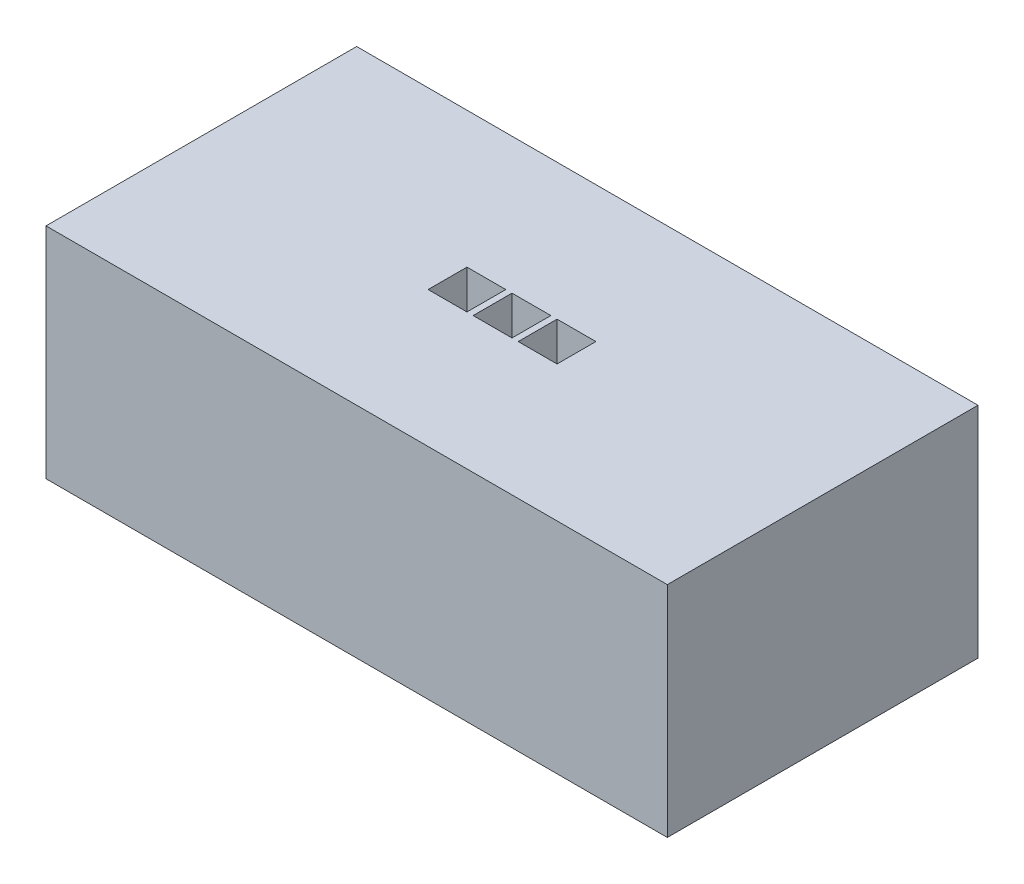
ISO-10303-21;
HEADER;
FILE_DESCRIPTION(('STEP AP214'),'2;1');
FILE_NAME('part.step','',(''),(''),'','','');
FILE_SCHEMA(('AUTOMOTIVE_DESIGN { 1 0 10303 214 1 1 1 1 }'));
ENDSEC;
DATA;
#1=APPLICATION_CONTEXT('core data for automotive mechanical design processes');
#2=APPLICATION_PROTOCOL_DEFINITION('international standard','automotive_design',2000,#1);
#3=PRODUCT_CONTEXT('',#1,'mechanical');
#4=PRODUCT('Part','Part','',(#3));
#5=PRODUCT_RELATED_PRODUCT_CATEGORY('part','',(#4));
#6=PRODUCT_DEFINITION_FORMATION('','',#4);
#7=PRODUCT_DEFINITION_CONTEXT('part definition',#1,'design');
#8=PRODUCT_DEFINITION('design','',#6,#7);
#9=PRODUCT_DEFINITION_SHAPE('','',#8);
#10=(LENGTH_UNIT() NAMED_UNIT(*) SI_UNIT(.MILLI.,.METRE.));
#11=(NAMED_UNIT(*) PLANE_ANGLE_UNIT() SI_UNIT($,.RADIAN.));
#12=(NAMED_UNIT(*) SI_UNIT($,.STERADIAN.) SOLID_ANGLE_UNIT());
#13=UNCERTAINTY_MEASURE_WITH_UNIT(LENGTH_MEASURE(1.E-05),#10,'distance_accuracy_value','');
#14=(GEOMETRIC_REPRESENTATION_CONTEXT(3) GLOBAL_UNCERTAINTY_ASSIGNED_CONTEXT((#13)) GLOBAL_UNIT_ASSIGNED_CONTEXT((#10,
#11,#12)) REPRESENTATION_CONTEXT('',''));
#15=CARTESIAN_POINT('',(0.,0.,0.));
#16=DIRECTION('',(0.,0.,1.));
#17=DIRECTION('',(1.,0.,0.));
#18=AXIS2_PLACEMENT_3D('',#15,#16,#17);
#19=CARTESIAN_POINT('',(20.,14.1,-10.));
#20=DIRECTION('',(0.,0.,1.));
#21=DIRECTION('',(1.,0.,0.));
#22=AXIS2_PLACEMENT_3D('',#19,#20,#21);
#23=PLANE('',#22);
#24=DIRECTION('',(-1.,0.,0.));
#25=VECTOR('',#24,1.);
#26=CARTESIAN_POINT('',(20.,0.,-10.));
#27=LINE('',#26,#25);
#28=CARTESIAN_POINT('',(20.,0.,-10.));
#29=VERTEX_POINT('',#28);
#30=CARTESIAN_POINT('',(-20.,0.,-10.));
#31=VERTEX_POINT('',#30);
#32=EDGE_CURVE('E181',#29,#31,#27,.T.);
#33=ORIENTED_EDGE('',*,*,#32,.T.);
#34=DIRECTION('',(0.,-1.,0.));
#35=VECTOR('',#34,1.);
#36=CARTESIAN_POINT('',(-20.,14.1,-10.));
#37=LINE('',#36,#35);
#38=CARTESIAN_POINT('',(-20.,14.1,-10.));
#39=VERTEX_POINT('',#38);
#40=EDGE_CURVE('E11',#39,#31,#37,.T.);
#41=ORIENTED_EDGE('',*,*,#40,.F.);
#42=DIRECTION('',(-1.,0.,0.));
#43=VECTOR('',#42,1.);
#44=CARTESIAN_POINT('',(20.,14.1,-10.));
#45=LINE('',#44,#43);
#46=CARTESIAN_POINT('',(20.,14.1,-10.));
#47=VERTEX_POINT('',#46);
#48=EDGE_CURVE('E246',#47,#39,#45,.T.);
#49=ORIENTED_EDGE('',*,*,#48,.F.);
#50=DIRECTION('',(0.,-1.,0.));
#51=VECTOR('',#50,1.);
#52=CARTESIAN_POINT('',(20.,14.1,-10.));
#53=LINE('',#52,#51);
#54=EDGE_CURVE('E258',#47,#29,#53,.T.);
#55=ORIENTED_EDGE('',*,*,#54,.T.);
#56=EDGE_LOOP('',(#33,#41,#49,#55));
#57=FACE_BOUND('',#56,.T.);
#58=ADVANCED_FACE('F32',(#57),#23,.F.);
#59=CARTESIAN_POINT('',(-20.,14.1,-10.));
#60=DIRECTION('',(1.,0.,0.));
#61=DIRECTION('',(0.,0.,-1.));
#62=AXIS2_PLACEMENT_3D('',#59,#60,#61);
#63=PLANE('',#62);
#64=DIRECTION('',(0.,0.,1.));
#65=VECTOR('',#64,1.);
#66=CARTESIAN_POINT('',(-20.,0.,-10.));
#67=LINE('',#66,#65);
#68=CARTESIAN_POINT('',(-20.,0.,10.));
#69=VERTEX_POINT('',#68);
#70=EDGE_CURVE('E261',#31,#69,#67,.T.);
#71=ORIENTED_EDGE('',*,*,#70,.T.);
#72=DIRECTION('',(0.,-1.,0.));
#73=VECTOR('',#72,1.);
#74=CARTESIAN_POINT('',(-20.,14.1,10.));
#75=LINE('',#74,#73);
#76=CARTESIAN_POINT('',(-20.,14.1,10.));
#77=VERTEX_POINT('',#76);
#78=EDGE_CURVE('E39',#77,#69,#75,.T.);
#79=ORIENTED_EDGE('',*,*,#78,.F.);
#80=DIRECTION('',(0.,0.,1.));
#81=VECTOR('',#80,1.);
#82=CARTESIAN_POINT('',(-20.,14.1,-10.));
#83=LINE('',#82,#81);
#84=EDGE_CURVE('E249',#39,#77,#83,.T.);
#85=ORIENTED_EDGE('',*,*,#84,.F.);
#86=ORIENTED_EDGE('',*,*,#40,.T.);
#87=EDGE_LOOP('',(#71,#79,#85,#86));
#88=FACE_BOUND('',#87,.T.);
#89=ADVANCED_FACE('F277',(#88),#63,.F.);
#90=CARTESIAN_POINT('',(20.,14.1,10.));
#91=DIRECTION('',(0.,0.,1.));
#92=DIRECTION('',(1.,0.,0.));
#93=AXIS2_PLACEMENT_3D('',#90,#91,#92);
#94=PLANE('',#93);
#95=DIRECTION('',(-1.,0.,0.));
#96=VECTOR('',#95,1.);
#97=CARTESIAN_POINT('',(20.,0.,10.));
#98=LINE('',#97,#96);
#99=CARTESIAN_POINT('',(20.,0.,10.));
#100=VERTEX_POINT('',#99);
#101=EDGE_CURVE('E264',#100,#69,#98,.T.);
#102=ORIENTED_EDGE('',*,*,#101,.F.);
#103=DIRECTION('',(0.,-1.,0.));
#104=VECTOR('',#103,1.);
#105=CARTESIAN_POINT('',(20.,14.1,10.));
#106=LINE('',#105,#104);
#107=CARTESIAN_POINT('',(20.,14.1,10.));
#108=VERTEX_POINT('',#107);
#109=EDGE_CURVE('E270',#108,#100,#106,.T.);
#110=ORIENTED_EDGE('',*,*,#109,.F.);
#111=DIRECTION('',(-1.,0.,0.));
#112=VECTOR('',#111,1.);
#113=CARTESIAN_POINT('',(20.,14.1,10.));
#114=LINE('',#113,#112);
#115=EDGE_CURVE('E252',#108,#77,#114,.T.);
#116=ORIENTED_EDGE('',*,*,#115,.T.);
#117=ORIENTED_EDGE('',*,*,#78,.T.);
#118=EDGE_LOOP('',(#102,#110,#116,#117));
#119=FACE_BOUND('',#118,.T.);
#120=ADVANCED_FACE('F274',(#119),#94,.T.);
#121=CARTESIAN_POINT('',(20.,14.1,-10.));
#122=DIRECTION('',(1.,0.,0.));
#123=DIRECTION('',(0.,0.,-1.));
#124=AXIS2_PLACEMENT_3D('',#121,#122,#123);
#125=PLANE('',#124);
#126=DIRECTION('',(0.,0.,1.));
#127=VECTOR('',#126,1.);
#128=CARTESIAN_POINT('',(20.,0.,-10.));
#129=LINE('',#128,#127);
#130=EDGE_CURVE('E250',#29,#100,#129,.T.);
#131=ORIENTED_EDGE('',*,*,#130,.F.);
#132=ORIENTED_EDGE('',*,*,#54,.F.);
#133=DIRECTION('',(0.,0.,1.));
#134=VECTOR('',#133,1.);
#135=CARTESIAN_POINT('',(20.,14.1,-10.));
#136=LINE('',#135,#134);
#137=EDGE_CURVE('E255',#47,#108,#136,.T.);
#138=ORIENTED_EDGE('',*,*,#137,.T.);
#139=ORIENTED_EDGE('',*,*,#109,.T.);
#140=EDGE_LOOP('',(#131,#132,#138,#139));
#141=FACE_BOUND('',#140,.T.);
#142=ADVANCED_FACE('F283',(#141),#125,.T.);
#143=CARTESIAN_POINT('',(0.,14.1,0.));
#144=DIRECTION('',(0.,1.,0.));
#145=DIRECTION('',(0.,0.,1.));
#146=AXIS2_PLACEMENT_3D('',#143,#144,#145);
#147=PLANE('',#146);
#148=DIRECTION('',(0.,0.,-1.));
#149=VECTOR('',#148,1.);
#150=CARTESIAN_POINT('',(-1.65,14.1,-1.25));
#151=LINE('',#150,#149);
#152=CARTESIAN_POINT('',(-1.65,14.1,1.25));
#153=VERTEX_POINT('',#152);
#154=CARTESIAN_POINT('',(-1.65,14.1,-1.25));
#155=VERTEX_POINT('',#154);
#156=EDGE_CURVE('E46',#153,#155,#151,.T.);
#157=ORIENTED_EDGE('',*,*,#156,.F.);
#158=DIRECTION('',(1.,0.,0.));
#159=VECTOR('',#158,1.);
#160=CARTESIAN_POINT('',(-4.15,14.1,1.25));
#161=LINE('',#160,#159);
#162=CARTESIAN_POINT('',(-4.15,14.1,1.25));
#163=VERTEX_POINT('',#162);
#164=EDGE_CURVE('E165',#163,#153,#161,.T.);
#165=ORIENTED_EDGE('',*,*,#164,.F.);
#166=DIRECTION('',(0.,0.,1.));
#167=VECTOR('',#166,1.);
#168=CARTESIAN_POINT('',(-4.15,14.1,-1.25));
#169=LINE('',#168,#167);
#170=CARTESIAN_POINT('',(-4.15,14.1,-1.25));
#171=VERTEX_POINT('',#170);
#172=EDGE_CURVE('E168',#171,#163,#169,.T.);
#173=ORIENTED_EDGE('',*,*,#172,.F.);
#174=DIRECTION('',(-1.,0.,0.));
#175=VECTOR('',#174,1.);
#176=CARTESIAN_POINT('',(-4.15,14.1,-1.25));
#177=LINE('',#176,#175);
#178=EDGE_CURVE('E174',#155,#171,#177,.T.);
#179=ORIENTED_EDGE('',*,*,#178,.F.);
#180=EDGE_LOOP('',(#157,#165,#173,#179));
#181=FACE_BOUND('',#180,.T.);
#182=DIRECTION('',(0.,0.,-1.));
#183=VECTOR('',#182,1.);
#184=CARTESIAN_POINT('',(1.25,14.1,-1.25));
#185=LINE('',#184,#183);
#186=CARTESIAN_POINT('',(1.25,14.1,1.25));
#187=VERTEX_POINT('',#186);
#188=CARTESIAN_POINT('',(1.25,14.1,-1.25));
#189=VERTEX_POINT('',#188);
#190=EDGE_CURVE('E54',#187,#189,#185,.T.);
#191=ORIENTED_EDGE('',*,*,#190,.F.);
#192=DIRECTION('',(1.,0.,0.));
#193=VECTOR('',#192,1.);
#194=CARTESIAN_POINT('',(-1.25,14.1,1.25));
#195=LINE('',#194,#193);
#196=CARTESIAN_POINT('',(-1.25,14.1,1.25));
#197=VERTEX_POINT('',#196);
#198=EDGE_CURVE('E189',#197,#187,#195,.T.);
#199=ORIENTED_EDGE('',*,*,#198,.F.);
#200=DIRECTION('',(0.,0.,1.));
#201=VECTOR('',#200,1.);
#202=CARTESIAN_POINT('',(-1.25,14.1,-1.25));
#203=LINE('',#202,#201);
#204=CARTESIAN_POINT('',(-1.25,14.1,-1.25));
#205=VERTEX_POINT('',#204);
#206=EDGE_CURVE('E204',#205,#197,#203,.T.);
#207=ORIENTED_EDGE('',*,*,#206,.F.);
#208=DIRECTION('',(-1.,0.,0.));
#209=VECTOR('',#208,1.);
#210=CARTESIAN_POINT('',(-1.25,14.1,-1.25));
#211=LINE('',#210,#209);
#212=EDGE_CURVE('E200',#189,#205,#211,.T.);
#213=ORIENTED_EDGE('',*,*,#212,.F.);
#214=EDGE_LOOP('',(#191,#199,#207,#213));
#215=FACE_BOUND('',#214,.T.);
#216=DIRECTION('',(0.,0.,-1.));
#217=VECTOR('',#216,1.);
#218=CARTESIAN_POINT('',(4.15,14.1,-1.25));
#219=LINE('',#218,#217);
#220=CARTESIAN_POINT('',(4.15,14.1,1.25));
#221=VERTEX_POINT('',#220);
#222=CARTESIAN_POINT('',(4.15,14.1,-1.25));
#223=VERTEX_POINT('',#222);
#224=EDGE_CURVE('E229',#221,#223,#219,.T.);
#225=ORIENTED_EDGE('',*,*,#224,.F.);
#226=DIRECTION('',(1.,0.,0.));
#227=VECTOR('',#226,1.);
#228=CARTESIAN_POINT('',(1.65,14.1,1.25));
#229=LINE('',#228,#227);
#230=CARTESIAN_POINT('',(1.65,14.1,1.25));
#231=VERTEX_POINT('',#230);
#232=EDGE_CURVE('E219',#231,#221,#229,.T.);
#233=ORIENTED_EDGE('',*,*,#232,.F.);
#234=DIRECTION('',(0.,0.,1.));
#235=VECTOR('',#234,1.);
#236=CARTESIAN_POINT('',(1.65,14.1,-1.25));
#237=LINE('',#236,#235);
#238=CARTESIAN_POINT('',(1.65,14.1,-1.25));
#239=VERTEX_POINT('',#238);
#240=EDGE_CURVE('E234',#239,#231,#237,.T.);
#241=ORIENTED_EDGE('',*,*,#240,.F.);
#242=DIRECTION('',(-1.,0.,0.));
#243=VECTOR('',#242,1.);
#244=CARTESIAN_POINT('',(1.65,14.1,-1.25));
#245=LINE('',#244,#243);
#246=EDGE_CURVE('E231',#223,#239,#245,.T.);
#247=ORIENTED_EDGE('',*,*,#246,.F.);
#248=EDGE_LOOP('',(#225,#233,#241,#247));
#249=FACE_BOUND('',#248,.T.);
#250=ORIENTED_EDGE('',*,*,#48,.T.);
#251=ORIENTED_EDGE('',*,*,#84,.T.);
#252=ORIENTED_EDGE('',*,*,#115,.F.);
#253=ORIENTED_EDGE('',*,*,#137,.F.);
#254=EDGE_LOOP('',(#250,#251,#252,#253));
#255=FACE_BOUND('',#254,.T.);
#256=ADVANCED_FACE('F287',(#181,#215,#249,#255),#147,.T.);
#257=CARTESIAN_POINT('',(0.,0.,0.));
#258=DIRECTION('',(0.,1.,0.));
#259=DIRECTION('',(0.,0.,1.));
#260=AXIS2_PLACEMENT_3D('',#257,#258,#259);
#261=PLANE('',#260);
#262=DIRECTION('',(1.,0.,0.));
#263=VECTOR('',#262,1.);
#264=CARTESIAN_POINT('',(-4.15,0.,1.25));
#265=LINE('',#264,#263);
#266=CARTESIAN_POINT('',(-4.15,0.,1.25));
#267=VERTEX_POINT('',#266);
#268=CARTESIAN_POINT('',(-1.65,0.,1.25));
#269=VERTEX_POINT('',#268);
#270=EDGE_CURVE('E152',#267,#269,#265,.T.);
#271=ORIENTED_EDGE('',*,*,#270,.T.);
#272=DIRECTION('',(0.,0.,-1.));
#273=VECTOR('',#272,1.);
#274=CARTESIAN_POINT('',(-1.65,0.,-1.25));
#275=LINE('',#274,#273);
#276=CARTESIAN_POINT('',(-1.65,0.,-1.25));
#277=VERTEX_POINT('',#276);
#278=EDGE_CURVE('E146',#269,#277,#275,.T.);
#279=ORIENTED_EDGE('',*,*,#278,.T.);
#280=DIRECTION('',(-1.,0.,0.));
#281=VECTOR('',#280,1.);
#282=CARTESIAN_POINT('',(-4.15,0.,-1.25));
#283=LINE('',#282,#281);
#284=CARTESIAN_POINT('',(-4.15,0.,-1.25));
#285=VERTEX_POINT('',#284);
#286=EDGE_CURVE('E156',#277,#285,#283,.T.);
#287=ORIENTED_EDGE('',*,*,#286,.T.);
#288=DIRECTION('',(0.,0.,1.));
#289=VECTOR('',#288,1.);
#290=CARTESIAN_POINT('',(-4.15,0.,-1.25));
#291=LINE('',#290,#289);
#292=EDGE_CURVE('E160',#285,#267,#291,.T.);
#293=ORIENTED_EDGE('',*,*,#292,.T.);
#294=EDGE_LOOP('',(#271,#279,#287,#293));
#295=FACE_BOUND('',#294,.T.);
#296=DIRECTION('',(1.,0.,0.));
#297=VECTOR('',#296,1.);
#298=CARTESIAN_POINT('',(-1.25,0.,1.25));
#299=LINE('',#298,#297);
#300=CARTESIAN_POINT('',(-1.25,0.,1.25));
#301=VERTEX_POINT('',#300);
#302=CARTESIAN_POINT('',(1.25,0.,1.25));
#303=VERTEX_POINT('',#302);
#304=EDGE_CURVE('E195',#301,#303,#299,.T.);
#305=ORIENTED_EDGE('',*,*,#304,.T.);
#306=DIRECTION('',(0.,0.,-1.));
#307=VECTOR('',#306,1.);
#308=CARTESIAN_POINT('',(1.25,0.,-1.25));
#309=LINE('',#308,#307);
#310=CARTESIAN_POINT('',(1.25,0.,-1.25));
#311=VERTEX_POINT('',#310);
#312=EDGE_CURVE('E185',#303,#311,#309,.T.);
#313=ORIENTED_EDGE('',*,*,#312,.T.);
#314=DIRECTION('',(-1.,0.,0.));
#315=VECTOR('',#314,1.);
#316=CARTESIAN_POINT('',(-1.25,0.,-1.25));
#317=LINE('',#316,#315);
#318=CARTESIAN_POINT('',(-1.25,0.,-1.25));
#319=VERTEX_POINT('',#318);
#320=EDGE_CURVE('E188',#311,#319,#317,.T.);
#321=ORIENTED_EDGE('',*,*,#320,.T.);
#322=DIRECTION('',(0.,0.,1.));
#323=VECTOR('',#322,1.);
#324=CARTESIAN_POINT('',(-1.25,0.,-1.25));
#325=LINE('',#324,#323);
#326=EDGE_CURVE('E192',#319,#301,#325,.T.);
#327=ORIENTED_EDGE('',*,*,#326,.T.);
#328=EDGE_LOOP('',(#305,#313,#321,#327));
#329=FACE_BOUND('',#328,.T.);
#330=DIRECTION('',(1.,0.,0.));
#331=VECTOR('',#330,1.);
#332=CARTESIAN_POINT('',(1.65,0.,1.25));
#333=LINE('',#332,#331);
#334=CARTESIAN_POINT('',(1.65,0.,1.25));
#335=VERTEX_POINT('',#334);
#336=CARTESIAN_POINT('',(4.15,0.,1.25));
#337=VERTEX_POINT('',#336);
#338=EDGE_CURVE('E225',#335,#337,#333,.T.);
#339=ORIENTED_EDGE('',*,*,#338,.T.);
#340=DIRECTION('',(0.,0.,-1.));
#341=VECTOR('',#340,1.);
#342=CARTESIAN_POINT('',(4.15,0.,-1.25));
#343=LINE('',#342,#341);
#344=CARTESIAN_POINT('',(4.15,0.,-1.25));
#345=VERTEX_POINT('',#344);
#346=EDGE_CURVE('E215',#337,#345,#343,.T.);
#347=ORIENTED_EDGE('',*,*,#346,.T.);
#348=DIRECTION('',(-1.,0.,0.));
#349=VECTOR('',#348,1.);
#350=CARTESIAN_POINT('',(1.65,0.,-1.25));
#351=LINE('',#350,#349);
#352=CARTESIAN_POINT('',(1.65,0.,-1.25));
#353=VERTEX_POINT('',#352);
#354=EDGE_CURVE('E218',#345,#353,#351,.T.);
#355=ORIENTED_EDGE('',*,*,#354,.T.);
#356=DIRECTION('',(0.,0.,1.));
#357=VECTOR('',#356,1.);
#358=CARTESIAN_POINT('',(1.65,0.,-1.25));
#359=LINE('',#358,#357);
#360=EDGE_CURVE('E222',#353,#335,#359,.T.);
#361=ORIENTED_EDGE('',*,*,#360,.T.);
#362=EDGE_LOOP('',(#339,#347,#355,#361));
#363=FACE_BOUND('',#362,.T.);
#364=ORIENTED_EDGE('',*,*,#32,.F.);
#365=ORIENTED_EDGE('',*,*,#130,.T.);
#366=ORIENTED_EDGE('',*,*,#101,.T.);
#367=ORIENTED_EDGE('',*,*,#70,.F.);
#368=EDGE_LOOP('',(#364,#365,#366,#367));
#369=FACE_BOUND('',#368,.T.);
#370=ADVANCED_FACE('F162',(#295,#329,#363,#369),#261,.F.);
#371=CARTESIAN_POINT('',(4.15,0.,-1.25));
#372=DIRECTION('',(1.,0.,0.));
#373=DIRECTION('',(0.,0.,-1.));
#374=AXIS2_PLACEMENT_3D('',#371,#372,#373);
#375=PLANE('',#374);
#376=ORIENTED_EDGE('',*,*,#224,.T.);
#377=DIRECTION('',(0.,1.,0.));
#378=VECTOR('',#377,1.);
#379=CARTESIAN_POINT('',(4.15,0.,-1.25));
#380=LINE('',#379,#378);
#381=EDGE_CURVE('E228',#345,#223,#380,.T.);
#382=ORIENTED_EDGE('',*,*,#381,.F.);
#383=ORIENTED_EDGE('',*,*,#346,.F.);
#384=DIRECTION('',(0.,1.,0.));
#385=VECTOR('',#384,1.);
#386=CARTESIAN_POINT('',(4.15,0.,1.25));
#387=LINE('',#386,#385);
#388=EDGE_CURVE('E201',#337,#221,#387,.T.);
#389=ORIENTED_EDGE('',*,*,#388,.T.);
#390=EDGE_LOOP('',(#376,#382,#383,#389));
#391=FACE_BOUND('',#390,.T.);
#392=ADVANCED_FACE('F302',(#391),#375,.F.);
#393=CARTESIAN_POINT('',(1.65,0.,1.25));
#394=DIRECTION('',(0.,0.,1.));
#395=DIRECTION('',(1.,0.,0.));
#396=AXIS2_PLACEMENT_3D('',#393,#394,#395);
#397=PLANE('',#396);
#398=ORIENTED_EDGE('',*,*,#232,.T.);
#399=ORIENTED_EDGE('',*,*,#388,.F.);
#400=ORIENTED_EDGE('',*,*,#338,.F.);
#401=DIRECTION('',(0.,1.,0.));
#402=VECTOR('',#401,1.);
#403=CARTESIAN_POINT('',(1.65,0.,1.25));
#404=LINE('',#403,#402);
#405=EDGE_CURVE('E240',#335,#231,#404,.T.);
#406=ORIENTED_EDGE('',*,*,#405,.T.);
#407=EDGE_LOOP('',(#398,#399,#400,#406));
#408=FACE_BOUND('',#407,.T.);
#409=ADVANCED_FACE('F308',(#408),#397,.F.);
#410=CARTESIAN_POINT('',(1.65,0.,-1.25));
#411=DIRECTION('',(-1.,0.,0.));
#412=DIRECTION('',(0.,0.,1.));
#413=AXIS2_PLACEMENT_3D('',#410,#411,#412);
#414=PLANE('',#413);
#415=ORIENTED_EDGE('',*,*,#240,.T.);
#416=ORIENTED_EDGE('',*,*,#405,.F.);
#417=ORIENTED_EDGE('',*,*,#360,.F.);
#418=DIRECTION('',(0.,1.,0.));
#419=VECTOR('',#418,1.);
#420=CARTESIAN_POINT('',(1.65,0.,-1.25));
#421=LINE('',#420,#419);
#422=EDGE_CURVE('E242',#353,#239,#421,.T.);
#423=ORIENTED_EDGE('',*,*,#422,.T.);
#424=EDGE_LOOP('',(#415,#416,#417,#423));
#425=FACE_BOUND('',#424,.T.);
#426=ADVANCED_FACE('F314',(#425),#414,.F.);
#427=CARTESIAN_POINT('',(1.65,0.,-1.25));
#428=DIRECTION('',(0.,0.,-1.));
#429=DIRECTION('',(-1.,0.,0.));
#430=AXIS2_PLACEMENT_3D('',#427,#428,#429);
#431=PLANE('',#430);
#432=ORIENTED_EDGE('',*,*,#246,.T.);
#433=ORIENTED_EDGE('',*,*,#422,.F.);
#434=ORIENTED_EDGE('',*,*,#354,.F.);
#435=ORIENTED_EDGE('',*,*,#381,.T.);
#436=EDGE_LOOP('',(#432,#433,#434,#435));
#437=FACE_BOUND('',#436,.T.);
#438=ADVANCED_FACE('F310',(#437),#431,.F.);
#439=CARTESIAN_POINT('',(1.25,0.,-1.25));
#440=DIRECTION('',(1.,0.,0.));
#441=DIRECTION('',(0.,0.,-1.));
#442=AXIS2_PLACEMENT_3D('',#439,#440,#441);
#443=PLANE('',#442);
#444=ORIENTED_EDGE('',*,*,#190,.T.);
#445=DIRECTION('',(0.,1.,0.));
#446=VECTOR('',#445,1.);
#447=CARTESIAN_POINT('',(1.25,0.,-1.25));
#448=LINE('',#447,#446);
#449=EDGE_CURVE('E198',#311,#189,#448,.T.);
#450=ORIENTED_EDGE('',*,*,#449,.F.);
#451=ORIENTED_EDGE('',*,*,#312,.F.);
#452=DIRECTION('',(0.,1.,0.));
#453=VECTOR('',#452,1.);
#454=CARTESIAN_POINT('',(1.25,0.,1.25));
#455=LINE('',#454,#453);
#456=EDGE_CURVE('E175',#303,#187,#455,.T.);
#457=ORIENTED_EDGE('',*,*,#456,.T.);
#458=EDGE_LOOP('',(#444,#450,#451,#457));
#459=FACE_BOUND('',#458,.T.);
#460=ADVANCED_FACE('F313',(#459),#443,.F.);
#461=CARTESIAN_POINT('',(-1.25,0.,1.25));
#462=DIRECTION('',(0.,0.,1.));
#463=DIRECTION('',(1.,0.,0.));
#464=AXIS2_PLACEMENT_3D('',#461,#462,#463);
#465=PLANE('',#464);
#466=ORIENTED_EDGE('',*,*,#198,.T.);
#467=ORIENTED_EDGE('',*,*,#456,.F.);
#468=ORIENTED_EDGE('',*,*,#304,.F.);
#469=DIRECTION('',(0.,1.,0.));
#470=VECTOR('',#469,1.);
#471=CARTESIAN_POINT('',(-1.25,0.,1.25));
#472=LINE('',#471,#470);
#473=EDGE_CURVE('E210',#301,#197,#472,.T.);
#474=ORIENTED_EDGE('',*,*,#473,.T.);
#475=EDGE_LOOP('',(#466,#467,#468,#474));
#476=FACE_BOUND('',#475,.T.);
#477=ADVANCED_FACE('F324',(#476),#465,.F.);
#478=CARTESIAN_POINT('',(-1.25,0.,-1.25));
#479=DIRECTION('',(-1.,0.,0.));
#480=DIRECTION('',(0.,0.,1.));
#481=AXIS2_PLACEMENT_3D('',#478,#479,#480);
#482=PLANE('',#481);
#483=ORIENTED_EDGE('',*,*,#206,.T.);
#484=ORIENTED_EDGE('',*,*,#473,.F.);
#485=ORIENTED_EDGE('',*,*,#326,.F.);
#486=DIRECTION('',(0.,1.,0.));
#487=VECTOR('',#486,1.);
#488=CARTESIAN_POINT('',(-1.25,0.,-1.25));
#489=LINE('',#488,#487);
#490=EDGE_CURVE('E212',#319,#205,#489,.T.);
#491=ORIENTED_EDGE('',*,*,#490,.T.);
#492=EDGE_LOOP('',(#483,#484,#485,#491));
#493=FACE_BOUND('',#492,.T.);
#494=ADVANCED_FACE('F328',(#493),#482,.F.);
#495=CARTESIAN_POINT('',(-1.25,0.,-1.25));
#496=DIRECTION('',(0.,0.,-1.));
#497=DIRECTION('',(-1.,0.,0.));
#498=AXIS2_PLACEMENT_3D('',#495,#496,#497);
#499=PLANE('',#498);
#500=ORIENTED_EDGE('',*,*,#212,.T.);
#501=ORIENTED_EDGE('',*,*,#490,.F.);
#502=ORIENTED_EDGE('',*,*,#320,.F.);
#503=ORIENTED_EDGE('',*,*,#449,.T.);
#504=EDGE_LOOP('',(#500,#501,#502,#503));
#505=FACE_BOUND('',#504,.T.);
#506=ADVANCED_FACE('F325',(#505),#499,.F.);
#507=CARTESIAN_POINT('',(-1.65,0.,-1.25));
#508=DIRECTION('',(1.,0.,0.));
#509=DIRECTION('',(0.,0.,-1.));
#510=AXIS2_PLACEMENT_3D('',#507,#508,#509);
#511=PLANE('',#510);
#512=ORIENTED_EDGE('',*,*,#156,.T.);
#513=DIRECTION('',(0.,1.,0.));
#514=VECTOR('',#513,1.);
#515=CARTESIAN_POINT('',(-1.65,0.,-1.25));
#516=LINE('',#515,#514);
#517=EDGE_CURVE('E142',#277,#155,#516,.T.);
#518=ORIENTED_EDGE('',*,*,#517,.F.);
#519=ORIENTED_EDGE('',*,*,#278,.F.);
#520=DIRECTION('',(0.,1.,0.));
#521=VECTOR('',#520,1.);
#522=CARTESIAN_POINT('',(-1.65,0.,1.25));
#523=LINE('',#522,#521);
#524=EDGE_CURVE('E179',#269,#153,#523,.T.);
#525=ORIENTED_EDGE('',*,*,#524,.T.);
#526=EDGE_LOOP('',(#512,#518,#519,#525));
#527=FACE_BOUND('',#526,.T.);
#528=ADVANCED_FACE('F144',(#527),#511,.F.);
#529=CARTESIAN_POINT('',(-4.15,0.,1.25));
#530=DIRECTION('',(0.,0.,1.));
#531=DIRECTION('',(1.,0.,0.));
#532=AXIS2_PLACEMENT_3D('',#529,#530,#531);
#533=PLANE('',#532);
#534=ORIENTED_EDGE('',*,*,#164,.T.);
#535=ORIENTED_EDGE('',*,*,#524,.F.);
#536=ORIENTED_EDGE('',*,*,#270,.F.);
#537=DIRECTION('',(0.,1.,0.));
#538=VECTOR('',#537,1.);
#539=CARTESIAN_POINT('',(-4.15,0.,1.25));
#540=LINE('',#539,#538);
#541=EDGE_CURVE('E182',#267,#163,#540,.T.);
#542=ORIENTED_EDGE('',*,*,#541,.T.);
#543=EDGE_LOOP('',(#534,#535,#536,#542));
#544=FACE_BOUND('',#543,.T.);
#545=ADVANCED_FACE('F338',(#544),#533,.F.);
#546=CARTESIAN_POINT('',(-4.15,0.,-1.25));
#547=DIRECTION('',(-1.,0.,0.));
#548=DIRECTION('',(0.,0.,1.));
#549=AXIS2_PLACEMENT_3D('',#546,#547,#548);
#550=PLANE('',#549);
#551=ORIENTED_EDGE('',*,*,#172,.T.);
#552=ORIENTED_EDGE('',*,*,#541,.F.);
#553=ORIENTED_EDGE('',*,*,#292,.F.);
#554=DIRECTION('',(0.,1.,0.));
#555=VECTOR('',#554,1.);
#556=CARTESIAN_POINT('',(-4.15,0.,-1.25));
#557=LINE('',#556,#555);
#558=EDGE_CURVE('E151',#285,#171,#557,.T.);
#559=ORIENTED_EDGE('',*,*,#558,.T.);
#560=EDGE_LOOP('',(#551,#552,#553,#559));
#561=FACE_BOUND('',#560,.T.);
#562=ADVANCED_FACE('F341',(#561),#550,.F.);
#563=CARTESIAN_POINT('',(-4.15,0.,-1.25));
#564=DIRECTION('',(0.,0.,-1.));
#565=DIRECTION('',(-1.,0.,0.));
#566=AXIS2_PLACEMENT_3D('',#563,#564,#565);
#567=PLANE('',#566);
#568=ORIENTED_EDGE('',*,*,#178,.T.);
#569=ORIENTED_EDGE('',*,*,#558,.F.);
#570=ORIENTED_EDGE('',*,*,#286,.F.);
#571=ORIENTED_EDGE('',*,*,#517,.T.);
#572=EDGE_LOOP('',(#568,#569,#570,#571));
#573=FACE_BOUND('',#572,.T.);
#574=ADVANCED_FACE('F157',(#573),#567,.F.);
#575=CLOSED_SHELL('',(#58,#89,#120,#142,#256,#370,#392,#409,#426,#438,#460,#477,#494,#506,#528,
#545,#562,#574));
#576=MANIFOLD_SOLID_BREP('B2',#575);
#577=ADVANCED_BREP_SHAPE_REPRESENTATION('',(#18,#576),#14);
#578=SHAPE_DEFINITION_REPRESENTATION(#9,#577);
ENDSEC;
END-ISO-10303-21;
